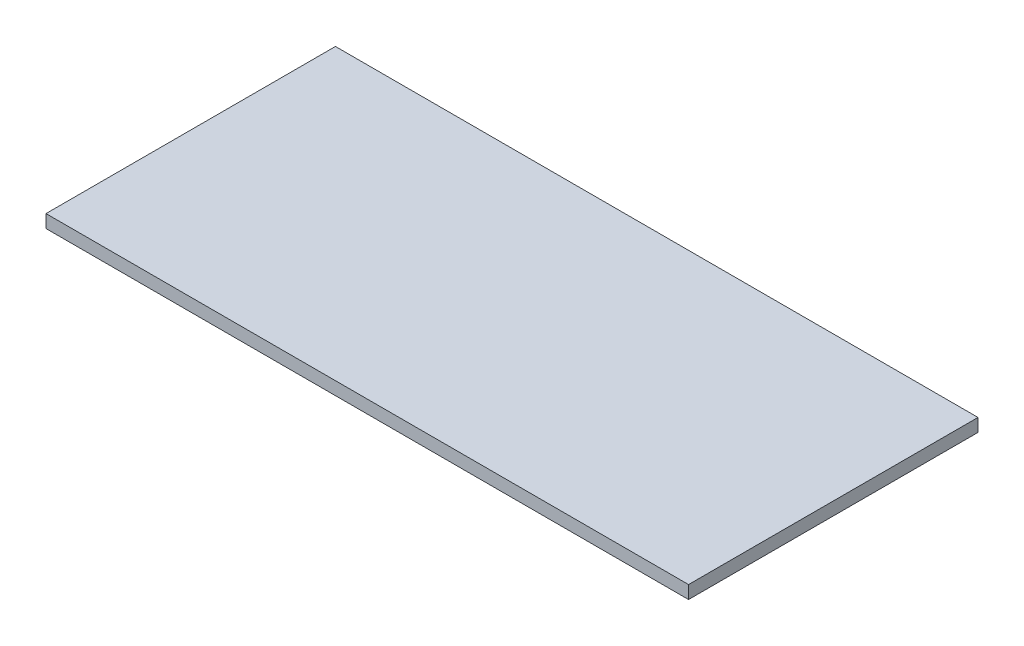
ISO-10303-21;
HEADER;
FILE_DESCRIPTION(('STEP AP214'),'2;1');
FILE_NAME('part.step','',(''),(''),'','','');
FILE_SCHEMA(('AUTOMOTIVE_DESIGN { 1 0 10303 214 1 1 1 1 }'));
ENDSEC;
DATA;
#1=APPLICATION_CONTEXT('core data for automotive mechanical design processes');
#2=APPLICATION_PROTOCOL_DEFINITION('international standard','automotive_design',2000,#1);
#3=PRODUCT_CONTEXT('',#1,'mechanical');
#4=PRODUCT('Part','Part','',(#3));
#5=PRODUCT_RELATED_PRODUCT_CATEGORY('part','',(#4));
#6=PRODUCT_DEFINITION_FORMATION('','',#4);
#7=PRODUCT_DEFINITION_CONTEXT('part definition',#1,'design');
#8=PRODUCT_DEFINITION('design','',#6,#7);
#9=PRODUCT_DEFINITION_SHAPE('','',#8);
#10=(LENGTH_UNIT() NAMED_UNIT(*) SI_UNIT(.MILLI.,.METRE.));
#11=(NAMED_UNIT(*) PLANE_ANGLE_UNIT() SI_UNIT($,.RADIAN.));
#12=(NAMED_UNIT(*) SI_UNIT($,.STERADIAN.) SOLID_ANGLE_UNIT());
#13=UNCERTAINTY_MEASURE_WITH_UNIT(LENGTH_MEASURE(1.E-05),#10,'distance_accuracy_value','');
#14=(GEOMETRIC_REPRESENTATION_CONTEXT(3) GLOBAL_UNCERTAINTY_ASSIGNED_CONTEXT((#13)) GLOBAL_UNIT_ASSIGNED_CONTEXT((#10,
#11,#12)) REPRESENTATION_CONTEXT('',''));
#15=CARTESIAN_POINT('',(0.,0.,0.));
#16=DIRECTION('',(0.,0.,1.));
#17=DIRECTION('',(1.,0.,0.));
#18=AXIS2_PLACEMENT_3D('',#15,#16,#17);
#19=CARTESIAN_POINT('',(245.,9.906,110.363));
#20=DIRECTION('',(-1.,0.,0.));
#21=DIRECTION('',(0.,0.,1.));
#22=AXIS2_PLACEMENT_3D('',#19,#20,#21);
#23=PLANE('',#22);
#24=DIRECTION('',(0.,0.,-1.));
#25=VECTOR('',#24,1.);
#26=CARTESIAN_POINT('',(245.,0.,110.363));
#27=LINE('',#26,#25);
#28=CARTESIAN_POINT('',(245.,0.,110.363));
#29=VERTEX_POINT('',#28);
#30=CARTESIAN_POINT('',(245.,0.,-110.363));
#31=VERTEX_POINT('',#30);
#32=EDGE_CURVE('E106',#29,#31,#27,.T.);
#33=ORIENTED_EDGE('',*,*,#32,.T.);
#34=DIRECTION('',(0.,-1.,0.));
#35=VECTOR('',#34,1.);
#36=CARTESIAN_POINT('',(245.,9.906,-110.363));
#37=LINE('',#36,#35);
#38=CARTESIAN_POINT('',(245.,9.906,-110.363));
#39=VERTEX_POINT('',#38);
#40=EDGE_CURVE('E11',#39,#31,#37,.T.);
#41=ORIENTED_EDGE('',*,*,#40,.F.);
#42=DIRECTION('',(0.,0.,-1.));
#43=VECTOR('',#42,1.);
#44=CARTESIAN_POINT('',(245.,9.906,110.363));
#45=LINE('',#44,#43);
#46=CARTESIAN_POINT('',(245.,9.906,110.363));
#47=VERTEX_POINT('',#46);
#48=EDGE_CURVE('E94',#47,#39,#45,.T.);
#49=ORIENTED_EDGE('',*,*,#48,.F.);
#50=DIRECTION('',(0.,-1.,0.));
#51=VECTOR('',#50,1.);
#52=CARTESIAN_POINT('',(245.,9.906,110.363));
#53=LINE('',#52,#51);
#54=EDGE_CURVE('E102',#47,#29,#53,.T.);
#55=ORIENTED_EDGE('',*,*,#54,.T.);
#56=EDGE_LOOP('',(#33,#41,#49,#55));
#57=FACE_BOUND('',#56,.T.);
#58=ADVANCED_FACE('F43',(#57),#23,.F.);
#59=CARTESIAN_POINT('',(-245.,9.906,-110.363));
#60=DIRECTION('',(0.,0.,1.));
#61=DIRECTION('',(1.,0.,0.));
#62=AXIS2_PLACEMENT_3D('',#59,#60,#61);
#63=PLANE('',#62);
#64=DIRECTION('',(-1.,0.,0.));
#65=VECTOR('',#64,1.);
#66=CARTESIAN_POINT('',(-245.,0.,-110.363));
#67=LINE('',#66,#65);
#68=CARTESIAN_POINT('',(-245.,0.,-110.363));
#69=VERTEX_POINT('',#68);
#70=EDGE_CURVE('E98',#31,#69,#67,.T.);
#71=ORIENTED_EDGE('',*,*,#70,.T.);
#72=DIRECTION('',(0.,-1.,0.));
#73=VECTOR('',#72,1.);
#74=CARTESIAN_POINT('',(-245.,9.906,-110.363));
#75=LINE('',#74,#73);
#76=CARTESIAN_POINT('',(-245.,9.906,-110.363));
#77=VERTEX_POINT('',#76);
#78=EDGE_CURVE('E51',#77,#69,#75,.T.);
#79=ORIENTED_EDGE('',*,*,#78,.F.);
#80=DIRECTION('',(-1.,0.,0.));
#81=VECTOR('',#80,1.);
#82=CARTESIAN_POINT('',(-245.,9.906,-110.363));
#83=LINE('',#82,#81);
#84=EDGE_CURVE('E89',#39,#77,#83,.T.);
#85=ORIENTED_EDGE('',*,*,#84,.F.);
#86=ORIENTED_EDGE('',*,*,#40,.T.);
#87=EDGE_LOOP('',(#71,#79,#85,#86));
#88=FACE_BOUND('',#87,.T.);
#89=ADVANCED_FACE('F97',(#88),#63,.F.);
#90=CARTESIAN_POINT('',(-245.,9.906,110.363));
#91=DIRECTION('',(1.,0.,0.));
#92=DIRECTION('',(0.,0.,-1.));
#93=AXIS2_PLACEMENT_3D('',#90,#91,#92);
#94=PLANE('',#93);
#95=DIRECTION('',(0.,0.,1.));
#96=VECTOR('',#95,1.);
#97=CARTESIAN_POINT('',(-245.,0.,110.363));
#98=LINE('',#97,#96);
#99=CARTESIAN_POINT('',(-245.,0.,110.363));
#100=VERTEX_POINT('',#99);
#101=EDGE_CURVE('E76',#69,#100,#98,.T.);
#102=ORIENTED_EDGE('',*,*,#101,.T.);
#103=DIRECTION('',(0.,-1.,0.));
#104=VECTOR('',#103,1.);
#105=CARTESIAN_POINT('',(-245.,9.906,110.363));
#106=LINE('',#105,#104);
#107=CARTESIAN_POINT('',(-245.,9.906,110.363));
#108=VERTEX_POINT('',#107);
#109=EDGE_CURVE('E99',#108,#100,#106,.T.);
#110=ORIENTED_EDGE('',*,*,#109,.F.);
#111=DIRECTION('',(0.,0.,1.));
#112=VECTOR('',#111,1.);
#113=CARTESIAN_POINT('',(-245.,9.906,110.363));
#114=LINE('',#113,#112);
#115=EDGE_CURVE('E92',#77,#108,#114,.T.);
#116=ORIENTED_EDGE('',*,*,#115,.F.);
#117=ORIENTED_EDGE('',*,*,#78,.T.);
#118=EDGE_LOOP('',(#102,#110,#116,#117));
#119=FACE_BOUND('',#118,.T.);
#120=ADVANCED_FACE('F100',(#119),#94,.F.);
#121=CARTESIAN_POINT('',(-245.,9.906,110.363));
#122=DIRECTION('',(0.,0.,-1.));
#123=DIRECTION('',(-1.,0.,0.));
#124=AXIS2_PLACEMENT_3D('',#121,#122,#123);
#125=PLANE('',#124);
#126=DIRECTION('',(1.,0.,0.));
#127=VECTOR('',#126,1.);
#128=CARTESIAN_POINT('',(-245.,0.,110.363));
#129=LINE('',#128,#127);
#130=EDGE_CURVE('E82',#100,#29,#129,.T.);
#131=ORIENTED_EDGE('',*,*,#130,.T.);
#132=ORIENTED_EDGE('',*,*,#54,.F.);
#133=DIRECTION('',(1.,0.,0.));
#134=VECTOR('',#133,1.);
#135=CARTESIAN_POINT('',(-245.,9.906,110.363));
#136=LINE('',#135,#134);
#137=EDGE_CURVE('E59',#108,#47,#136,.T.);
#138=ORIENTED_EDGE('',*,*,#137,.F.);
#139=ORIENTED_EDGE('',*,*,#109,.T.);
#140=EDGE_LOOP('',(#131,#132,#138,#139));
#141=FACE_BOUND('',#140,.T.);
#142=ADVANCED_FACE('F113',(#141),#125,.F.);
#143=CARTESIAN_POINT('',(0.,9.906,0.));
#144=DIRECTION('',(0.,-1.,0.));
#145=DIRECTION('',(0.,0.,-1.));
#146=AXIS2_PLACEMENT_3D('',#143,#144,#145);
#147=PLANE('',#146);
#148=ORIENTED_EDGE('',*,*,#48,.T.);
#149=ORIENTED_EDGE('',*,*,#84,.T.);
#150=ORIENTED_EDGE('',*,*,#115,.T.);
#151=ORIENTED_EDGE('',*,*,#137,.T.);
#152=EDGE_LOOP('',(#148,#149,#150,#151));
#153=FACE_BOUND('',#152,.T.);
#154=ADVANCED_FACE('F90',(#153),#147,.F.);
#155=CARTESIAN_POINT('',(0.,0.,0.));
#156=DIRECTION('',(0.,-1.,0.));
#157=DIRECTION('',(0.,0.,-1.));
#158=AXIS2_PLACEMENT_3D('',#155,#156,#157);
#159=PLANE('',#158);
#160=ORIENTED_EDGE('',*,*,#32,.F.);
#161=ORIENTED_EDGE('',*,*,#130,.F.);
#162=ORIENTED_EDGE('',*,*,#101,.F.);
#163=ORIENTED_EDGE('',*,*,#70,.F.);
#164=EDGE_LOOP('',(#160,#161,#162,#163));
#165=FACE_BOUND('',#164,.T.);
#166=ADVANCED_FACE('F116',(#165),#159,.T.);
#167=CLOSED_SHELL('',(#58,#89,#120,#142,#154,#166));
#168=MANIFOLD_SOLID_BREP('B2',#167);
#169=ADVANCED_BREP_SHAPE_REPRESENTATION('',(#18,#168),#14);
#170=SHAPE_DEFINITION_REPRESENTATION(#9,#169);
ENDSEC;
END-ISO-10303-21;
